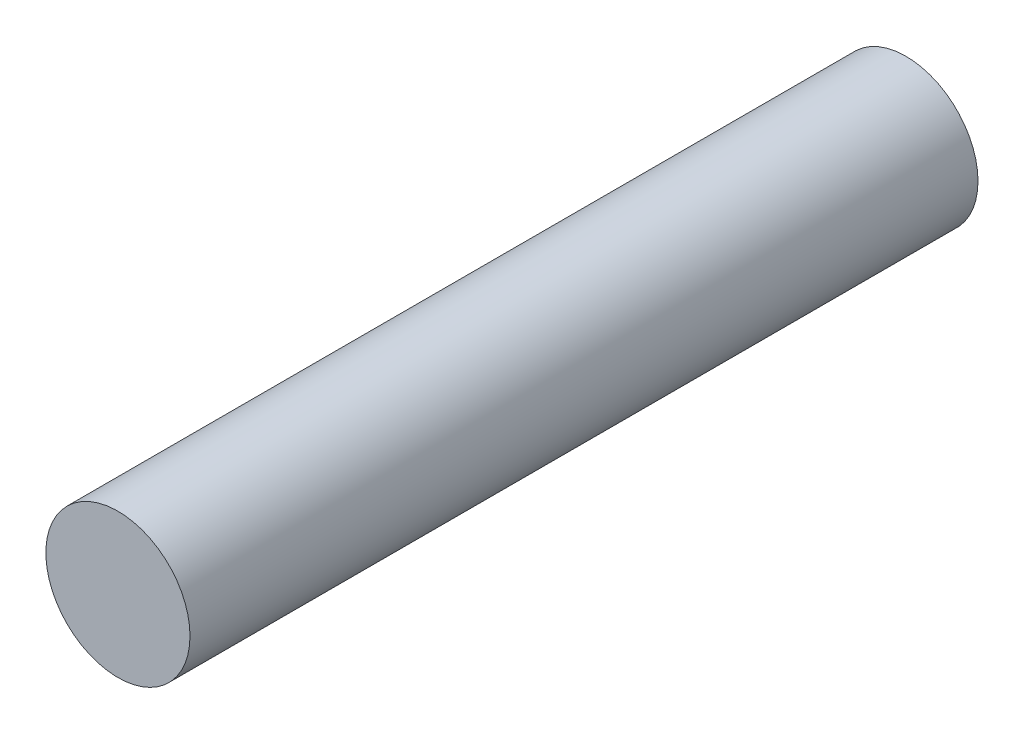
ISO-10303-21;
HEADER;
FILE_DESCRIPTION(('STEP AP214'),'2;1');
FILE_NAME('part.step','',(''),(''),'','','');
FILE_SCHEMA(('AUTOMOTIVE_DESIGN { 1 0 10303 214 1 1 1 1 }'));
ENDSEC;
DATA;
#1=APPLICATION_CONTEXT('core data for automotive mechanical design processes');
#2=APPLICATION_PROTOCOL_DEFINITION('international standard','automotive_design',2000,#1);
#3=PRODUCT_CONTEXT('',#1,'mechanical');
#4=PRODUCT('Part','Part','',(#3));
#5=PRODUCT_RELATED_PRODUCT_CATEGORY('part','',(#4));
#6=PRODUCT_DEFINITION_FORMATION('','',#4);
#7=PRODUCT_DEFINITION_CONTEXT('part definition',#1,'design');
#8=PRODUCT_DEFINITION('design','',#6,#7);
#9=PRODUCT_DEFINITION_SHAPE('','',#8);
#10=(LENGTH_UNIT() NAMED_UNIT(*) SI_UNIT(.MILLI.,.METRE.));
#11=(NAMED_UNIT(*) PLANE_ANGLE_UNIT() SI_UNIT($,.RADIAN.));
#12=(NAMED_UNIT(*) SI_UNIT($,.STERADIAN.) SOLID_ANGLE_UNIT());
#13=UNCERTAINTY_MEASURE_WITH_UNIT(LENGTH_MEASURE(1.E-05),#10,'distance_accuracy_value','');
#14=(GEOMETRIC_REPRESENTATION_CONTEXT(3) GLOBAL_UNCERTAINTY_ASSIGNED_CONTEXT((#13)) GLOBAL_UNIT_ASSIGNED_CONTEXT((#10,
#11,#12)) REPRESENTATION_CONTEXT('',''));
#15=CARTESIAN_POINT('',(0.,0.,0.));
#16=DIRECTION('',(0.,0.,1.));
#17=DIRECTION('',(1.,0.,0.));
#18=AXIS2_PLACEMENT_3D('',#15,#16,#17);
#19=CARTESIAN_POINT('',(0.,0.,82.));
#20=DIRECTION('',(0.,0.,-1.));
#21=DIRECTION('',(-1.,0.,0.));
#22=AXIS2_PLACEMENT_3D('',#19,#20,#21);
#23=CYLINDRICAL_SURFACE('',#22,7.5);
#24=CARTESIAN_POINT('',(0.,0.,82.));
#25=DIRECTION('',(0.,0.,1.));
#26=DIRECTION('',(1.,0.,0.));
#27=AXIS2_PLACEMENT_3D('',#24,#25,#26);
#28=CIRCLE('',#27,7.5);
#29=CARTESIAN_POINT('',(7.5,0.,82.));
#30=VERTEX_POINT('',#29);
#31=EDGE_CURVE('E10',#30,#30,#28,.T.);
#32=ORIENTED_EDGE('',*,*,#31,.F.);
#33=EDGE_LOOP('',(#32));
#34=FACE_BOUND('',#33,.T.);
#35=CARTESIAN_POINT('',(0.,0.,0.));
#36=DIRECTION('',(0.,0.,1.));
#37=DIRECTION('',(1.,0.,0.));
#38=AXIS2_PLACEMENT_3D('',#35,#36,#37);
#39=CIRCLE('',#38,7.5);
#40=CARTESIAN_POINT('',(7.5,0.,0.));
#41=VERTEX_POINT('',#40);
#42=EDGE_CURVE('E33',#41,#41,#39,.T.);
#43=ORIENTED_EDGE('',*,*,#42,.T.);
#44=EDGE_LOOP('',(#43));
#45=FACE_BOUND('',#44,.T.);
#46=ADVANCED_FACE('F30',(#34,#45),#23,.T.);
#47=CARTESIAN_POINT('',(0.,0.,82.));
#48=DIRECTION('',(0.,0.,1.));
#49=DIRECTION('',(1.,0.,0.));
#50=AXIS2_PLACEMENT_3D('',#47,#48,#49);
#51=PLANE('',#50);
#52=ORIENTED_EDGE('',*,*,#31,.T.);
#53=EDGE_LOOP('',(#52));
#54=FACE_BOUND('',#53,.T.);
#55=ADVANCED_FACE('F45',(#54),#51,.T.);
#56=CARTESIAN_POINT('',(0.,0.,0.));
#57=DIRECTION('',(0.,0.,1.));
#58=DIRECTION('',(1.,0.,0.));
#59=AXIS2_PLACEMENT_3D('',#56,#57,#58);
#60=PLANE('',#59);
#61=ORIENTED_EDGE('',*,*,#42,.F.);
#62=EDGE_LOOP('',(#61));
#63=FACE_BOUND('',#62,.T.);
#64=ADVANCED_FACE('F43',(#63),#60,.F.);
#65=CLOSED_SHELL('',(#46,#55,#64));
#66=MANIFOLD_SOLID_BREP('B2',#65);
#67=ADVANCED_BREP_SHAPE_REPRESENTATION('',(#18,#66),#14);
#68=SHAPE_DEFINITION_REPRESENTATION(#9,#67);
ENDSEC;
END-ISO-10303-21;
